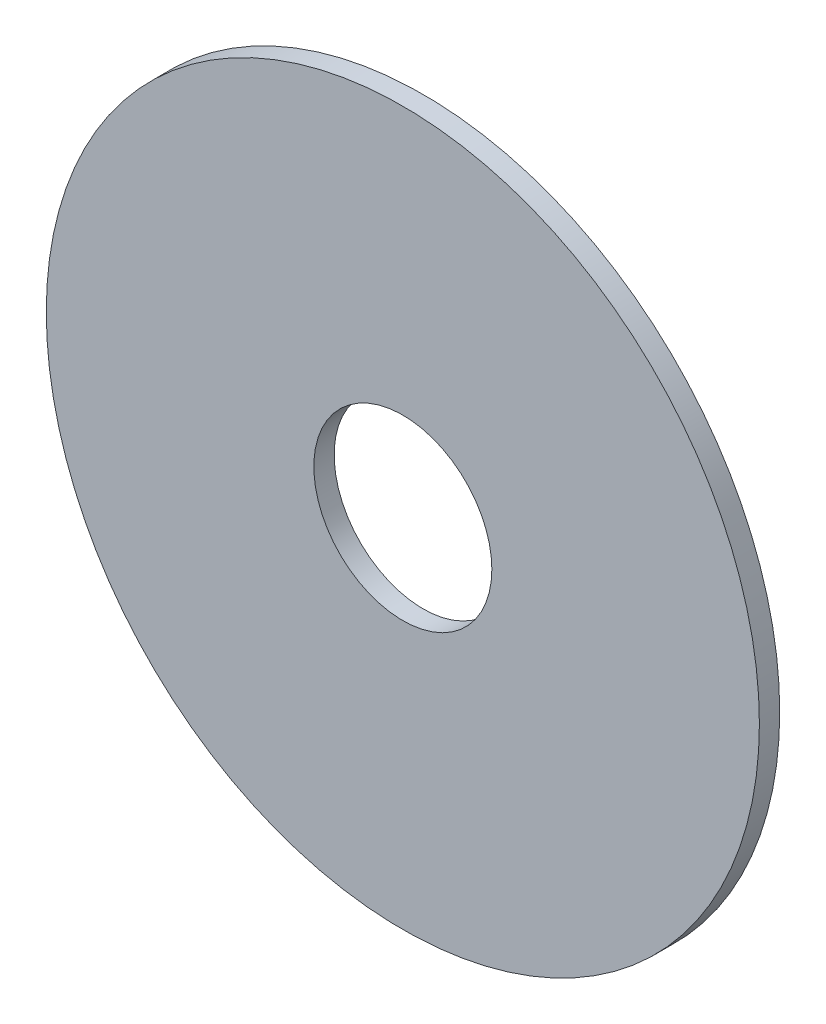
ISO-10303-21;
HEADER;
FILE_DESCRIPTION(('STEP AP214'),'2;1');
FILE_NAME('part.step','',(''),(''),'','','');
FILE_SCHEMA(('AUTOMOTIVE_DESIGN { 1 0 10303 214 1 1 1 1 }'));
ENDSEC;
DATA;
#1=APPLICATION_CONTEXT('core data for automotive mechanical design processes');
#2=APPLICATION_PROTOCOL_DEFINITION('international standard','automotive_design',2000,#1);
#3=PRODUCT_CONTEXT('',#1,'mechanical');
#4=PRODUCT('Part','Part','',(#3));
#5=PRODUCT_RELATED_PRODUCT_CATEGORY('part','',(#4));
#6=PRODUCT_DEFINITION_FORMATION('','',#4);
#7=PRODUCT_DEFINITION_CONTEXT('part definition',#1,'design');
#8=PRODUCT_DEFINITION('design','',#6,#7);
#9=PRODUCT_DEFINITION_SHAPE('','',#8);
#10=(LENGTH_UNIT() NAMED_UNIT(*) SI_UNIT(.MILLI.,.METRE.));
#11=(NAMED_UNIT(*) PLANE_ANGLE_UNIT() SI_UNIT($,.RADIAN.));
#12=(NAMED_UNIT(*) SI_UNIT($,.STERADIAN.) SOLID_ANGLE_UNIT());
#13=UNCERTAINTY_MEASURE_WITH_UNIT(LENGTH_MEASURE(1.E-05),#10,'distance_accuracy_value','');
#14=(GEOMETRIC_REPRESENTATION_CONTEXT(3) GLOBAL_UNCERTAINTY_ASSIGNED_CONTEXT((#13)) GLOBAL_UNIT_ASSIGNED_CONTEXT((#10,
#11,#12)) REPRESENTATION_CONTEXT('',''));
#15=CARTESIAN_POINT('',(0.,0.,0.));
#16=DIRECTION('',(0.,0.,1.));
#17=DIRECTION('',(1.,0.,0.));
#18=AXIS2_PLACEMENT_3D('',#15,#16,#17);
#19=CARTESIAN_POINT('',(0.,0.,0.725));
#20=DIRECTION('',(0.,0.,1.));
#21=DIRECTION('',(1.,0.,0.));
#22=AXIS2_PLACEMENT_3D('',#19,#20,#21);
#23=PLANE('',#22);
#24=CARTESIAN_POINT('',(0.,0.,0.725));
#25=DIRECTION('',(0.,0.,1.));
#26=DIRECTION('',(1.,0.,0.));
#27=AXIS2_PLACEMENT_3D('',#24,#25,#26);
#28=CIRCLE('',#27,25.435);
#29=CARTESIAN_POINT('',(25.435,0.,0.725));
#30=VERTEX_POINT('',#29);
#31=EDGE_CURVE('E10',#30,#30,#28,.T.);
#32=ORIENTED_EDGE('',*,*,#31,.T.);
#33=EDGE_LOOP('',(#32));
#34=FACE_BOUND('',#33,.T.);
#35=CARTESIAN_POINT('',(0.,0.,0.725));
#36=DIRECTION('',(0.,0.,1.));
#37=DIRECTION('',(1.,0.,0.));
#38=AXIS2_PLACEMENT_3D('',#35,#36,#37);
#39=CIRCLE('',#38,6.35);
#40=CARTESIAN_POINT('',(6.35,0.,0.725));
#41=VERTEX_POINT('',#40);
#42=EDGE_CURVE('E44',#41,#41,#39,.T.);
#43=ORIENTED_EDGE('',*,*,#42,.F.);
#44=EDGE_LOOP('',(#43));
#45=FACE_BOUND('',#44,.T.);
#46=ADVANCED_FACE('F33',(#34,#45),#23,.T.);
#47=CARTESIAN_POINT('',(0.,0.,-0.725));
#48=DIRECTION('',(0.,0.,1.));
#49=DIRECTION('',(1.,0.,0.));
#50=AXIS2_PLACEMENT_3D('',#47,#48,#49);
#51=PLANE('',#50);
#52=CARTESIAN_POINT('',(0.,0.,-0.725));
#53=DIRECTION('',(0.,0.,1.));
#54=DIRECTION('',(1.,0.,0.));
#55=AXIS2_PLACEMENT_3D('',#52,#53,#54);
#56=CIRCLE('',#55,25.435);
#57=CARTESIAN_POINT('',(25.435,0.,-0.725));
#58=VERTEX_POINT('',#57);
#59=EDGE_CURVE('E37',#58,#58,#56,.T.);
#60=ORIENTED_EDGE('',*,*,#59,.F.);
#61=EDGE_LOOP('',(#60));
#62=FACE_BOUND('',#61,.T.);
#63=CARTESIAN_POINT('',(0.,0.,-0.725));
#64=DIRECTION('',(0.,0.,1.));
#65=DIRECTION('',(1.,0.,0.));
#66=AXIS2_PLACEMENT_3D('',#63,#64,#65);
#67=CIRCLE('',#66,6.35);
#68=CARTESIAN_POINT('',(6.35,0.,-0.725));
#69=VERTEX_POINT('',#68);
#70=EDGE_CURVE('E46',#69,#69,#67,.T.);
#71=ORIENTED_EDGE('',*,*,#70,.T.);
#72=EDGE_LOOP('',(#71));
#73=FACE_BOUND('',#72,.T.);
#74=ADVANCED_FACE('F56',(#62,#73),#51,.F.);
#75=CARTESIAN_POINT('',(0.,0.,0.725));
#76=DIRECTION('',(0.,0.,-1.));
#77=DIRECTION('',(-1.,0.,0.));
#78=AXIS2_PLACEMENT_3D('',#75,#76,#77);
#79=CYLINDRICAL_SURFACE('',#78,25.435);
#80=ORIENTED_EDGE('',*,*,#31,.F.);
#81=EDGE_LOOP('',(#80));
#82=FACE_BOUND('',#81,.T.);
#83=ORIENTED_EDGE('',*,*,#59,.T.);
#84=EDGE_LOOP('',(#83));
#85=FACE_BOUND('',#84,.T.);
#86=ADVANCED_FACE('F35',(#82,#85),#79,.T.);
#87=CARTESIAN_POINT('',(0.,0.,0.725));
#88=DIRECTION('',(0.,0.,-1.));
#89=DIRECTION('',(-1.,0.,0.));
#90=AXIS2_PLACEMENT_3D('',#87,#88,#89);
#91=CYLINDRICAL_SURFACE('',#90,6.35);
#92=ORIENTED_EDGE('',*,*,#42,.T.);
#93=EDGE_LOOP('',(#92));
#94=FACE_BOUND('',#93,.T.);
#95=ORIENTED_EDGE('',*,*,#70,.F.);
#96=EDGE_LOOP('',(#95));
#97=FACE_BOUND('',#96,.T.);
#98=ADVANCED_FACE('F52',(#94,#97),#91,.F.);
#99=CLOSED_SHELL('',(#46,#74,#86,#98));
#100=MANIFOLD_SOLID_BREP('B2',#99);
#101=ADVANCED_BREP_SHAPE_REPRESENTATION('',(#18,#100),#14);
#102=SHAPE_DEFINITION_REPRESENTATION(#9,#101);
ENDSEC;
END-ISO-10303-21;
